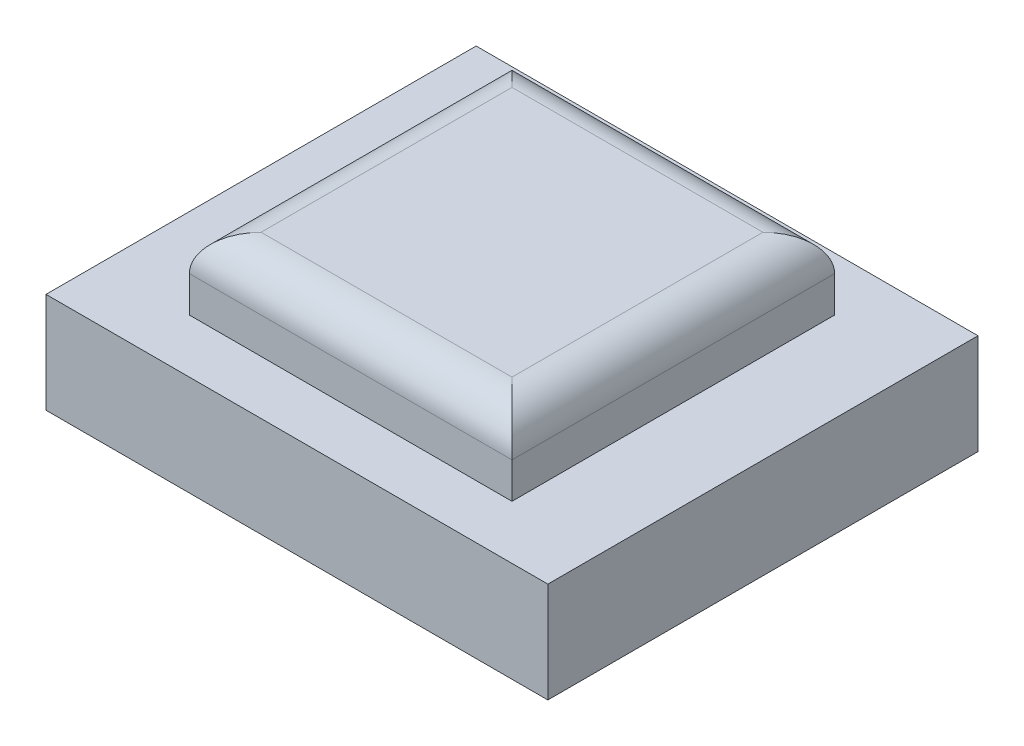
ISO-10303-21;
HEADER;
FILE_DESCRIPTION(('STEP AP214'),'2;1');
FILE_NAME('part.step','',(''),(''),'','','');
FILE_SCHEMA(('AUTOMOTIVE_DESIGN { 1 0 10303 214 1 1 1 1 }'));
ENDSEC;
DATA;
#1=APPLICATION_CONTEXT('core data for automotive mechanical design processes');
#2=APPLICATION_PROTOCOL_DEFINITION('international standard','automotive_design',2000,#1);
#3=PRODUCT_CONTEXT('',#1,'mechanical');
#4=PRODUCT('Part','Part','',(#3));
#5=PRODUCT_RELATED_PRODUCT_CATEGORY('part','',(#4));
#6=PRODUCT_DEFINITION_FORMATION('','',#4);
#7=PRODUCT_DEFINITION_CONTEXT('part definition',#1,'design');
#8=PRODUCT_DEFINITION('design','',#6,#7);
#9=PRODUCT_DEFINITION_SHAPE('','',#8);
#10=(LENGTH_UNIT() NAMED_UNIT(*) SI_UNIT(.MILLI.,.METRE.));
#11=(NAMED_UNIT(*) PLANE_ANGLE_UNIT() SI_UNIT($,.RADIAN.));
#12=(NAMED_UNIT(*) SI_UNIT($,.STERADIAN.) SOLID_ANGLE_UNIT());
#13=UNCERTAINTY_MEASURE_WITH_UNIT(LENGTH_MEASURE(1.E-05),#10,'distance_accuracy_value','');
#14=(GEOMETRIC_REPRESENTATION_CONTEXT(3) GLOBAL_UNCERTAINTY_ASSIGNED_CONTEXT((#13)) GLOBAL_UNIT_ASSIGNED_CONTEXT((#10,
#11,#12)) REPRESENTATION_CONTEXT('',''));
#15=CARTESIAN_POINT('',(0.,0.,0.));
#16=DIRECTION('',(0.,0.,1.));
#17=DIRECTION('',(1.,0.,0.));
#18=AXIS2_PLACEMENT_3D('',#15,#16,#17);
#19=CARTESIAN_POINT('',(1.75,0.7,-1.5));
#20=DIRECTION('',(-1.,0.,0.));
#21=DIRECTION('',(0.,0.,1.));
#22=AXIS2_PLACEMENT_3D('',#19,#20,#21);
#23=PLANE('',#22);
#24=DIRECTION('',(0.,0.,-1.));
#25=VECTOR('',#24,1.);
#26=CARTESIAN_POINT('',(1.75,0.,-1.5));
#27=LINE('',#26,#25);
#28=CARTESIAN_POINT('',(1.75,0.,1.5));
#29=VERTEX_POINT('',#28);
#30=CARTESIAN_POINT('',(1.75,0.,-1.5));
#31=VERTEX_POINT('',#30);
#32=EDGE_CURVE('E138',#29,#31,#27,.T.);
#33=ORIENTED_EDGE('',*,*,#32,.T.);
#34=DIRECTION('',(0.,-1.,0.));
#35=VECTOR('',#34,1.);
#36=CARTESIAN_POINT('',(1.75,0.7,-1.5));
#37=LINE('',#36,#35);
#38=CARTESIAN_POINT('',(1.75,0.7,-1.5));
#39=VERTEX_POINT('',#38);
#40=EDGE_CURVE('E168',#39,#31,#37,.T.);
#41=ORIENTED_EDGE('',*,*,#40,.F.);
#42=DIRECTION('',(0.,0.,-1.));
#43=VECTOR('',#42,1.);
#44=CARTESIAN_POINT('',(1.75,0.7,-1.5));
#45=LINE('',#44,#43);
#46=CARTESIAN_POINT('',(1.75,0.7,1.5));
#47=VERTEX_POINT('',#46);
#48=EDGE_CURVE('E142',#47,#39,#45,.T.);
#49=ORIENTED_EDGE('',*,*,#48,.F.);
#50=DIRECTION('',(0.,-1.,0.));
#51=VECTOR('',#50,1.);
#52=CARTESIAN_POINT('',(1.75,0.7,1.5));
#53=LINE('',#52,#51);
#54=EDGE_CURVE('E152',#47,#29,#53,.T.);
#55=ORIENTED_EDGE('',*,*,#54,.T.);
#56=EDGE_LOOP('',(#33,#41,#49,#55));
#57=FACE_BOUND('',#56,.T.);
#58=ADVANCED_FACE('F33',(#57),#23,.F.);
#59=CARTESIAN_POINT('',(-1.75,0.7,-1.5));
#60=DIRECTION('',(0.,0.,1.));
#61=DIRECTION('',(1.,0.,0.));
#62=AXIS2_PLACEMENT_3D('',#59,#60,#61);
#63=PLANE('',#62);
#64=DIRECTION('',(-1.,0.,0.));
#65=VECTOR('',#64,1.);
#66=CARTESIAN_POINT('',(-1.75,0.,-1.5));
#67=LINE('',#66,#65);
#68=CARTESIAN_POINT('',(-1.75,0.,-1.5));
#69=VERTEX_POINT('',#68);
#70=EDGE_CURVE('E155',#31,#69,#67,.T.);
#71=ORIENTED_EDGE('',*,*,#70,.T.);
#72=DIRECTION('',(0.,-1.,0.));
#73=VECTOR('',#72,1.);
#74=CARTESIAN_POINT('',(-1.75,0.7,-1.5));
#75=LINE('',#74,#73);
#76=CARTESIAN_POINT('',(-1.75,0.7,-1.5));
#77=VERTEX_POINT('',#76);
#78=EDGE_CURVE('E165',#77,#69,#75,.T.);
#79=ORIENTED_EDGE('',*,*,#78,.F.);
#80=DIRECTION('',(-1.,0.,0.));
#81=VECTOR('',#80,1.);
#82=CARTESIAN_POINT('',(-1.75,0.7,-1.5));
#83=LINE('',#82,#81);
#84=EDGE_CURVE('E145',#39,#77,#83,.T.);
#85=ORIENTED_EDGE('',*,*,#84,.F.);
#86=ORIENTED_EDGE('',*,*,#40,.T.);
#87=EDGE_LOOP('',(#71,#79,#85,#86));
#88=FACE_BOUND('',#87,.T.);
#89=ADVANCED_FACE('F220',(#88),#63,.F.);
#90=CARTESIAN_POINT('',(-1.75,0.7,-1.5));
#91=DIRECTION('',(1.,0.,0.));
#92=DIRECTION('',(0.,0.,-1.));
#93=AXIS2_PLACEMENT_3D('',#90,#91,#92);
#94=PLANE('',#93);
#95=DIRECTION('',(0.,0.,1.));
#96=VECTOR('',#95,1.);
#97=CARTESIAN_POINT('',(-1.75,0.,-1.5));
#98=LINE('',#97,#96);
#99=CARTESIAN_POINT('',(-1.75,0.,1.5));
#100=VERTEX_POINT('',#99);
#101=EDGE_CURVE('E157',#69,#100,#98,.T.);
#102=ORIENTED_EDGE('',*,*,#101,.T.);
#103=DIRECTION('',(0.,-1.,0.));
#104=VECTOR('',#103,1.);
#105=CARTESIAN_POINT('',(-1.75,0.7,1.5));
#106=LINE('',#105,#104);
#107=CARTESIAN_POINT('',(-1.75,0.7,1.5));
#108=VERTEX_POINT('',#107);
#109=EDGE_CURVE('E162',#108,#100,#106,.T.);
#110=ORIENTED_EDGE('',*,*,#109,.F.);
#111=DIRECTION('',(0.,0.,1.));
#112=VECTOR('',#111,1.);
#113=CARTESIAN_POINT('',(-1.75,0.7,-1.5));
#114=LINE('',#113,#112);
#115=EDGE_CURVE('E148',#77,#108,#114,.T.);
#116=ORIENTED_EDGE('',*,*,#115,.F.);
#117=ORIENTED_EDGE('',*,*,#78,.T.);
#118=EDGE_LOOP('',(#102,#110,#116,#117));
#119=FACE_BOUND('',#118,.T.);
#120=ADVANCED_FACE('F226',(#119),#94,.F.);
#121=CARTESIAN_POINT('',(-1.75,0.7,1.5));
#122=DIRECTION('',(0.,0.,-1.));
#123=DIRECTION('',(-1.,0.,0.));
#124=AXIS2_PLACEMENT_3D('',#121,#122,#123);
#125=PLANE('',#124);
#126=DIRECTION('',(1.,0.,0.));
#127=VECTOR('',#126,1.);
#128=CARTESIAN_POINT('',(-1.75,0.,1.5));
#129=LINE('',#128,#127);
#130=EDGE_CURVE('E146',#100,#29,#129,.T.);
#131=ORIENTED_EDGE('',*,*,#130,.T.);
#132=ORIENTED_EDGE('',*,*,#54,.F.);
#133=DIRECTION('',(1.,0.,0.));
#134=VECTOR('',#133,1.);
#135=CARTESIAN_POINT('',(-1.75,0.7,1.5));
#136=LINE('',#135,#134);
#137=EDGE_CURVE('E150',#108,#47,#136,.T.);
#138=ORIENTED_EDGE('',*,*,#137,.F.);
#139=ORIENTED_EDGE('',*,*,#109,.T.);
#140=EDGE_LOOP('',(#131,#132,#138,#139));
#141=FACE_BOUND('',#140,.T.);
#142=ADVANCED_FACE('F305',(#141),#125,.F.);
#143=CARTESIAN_POINT('',(0.,0.7,0.));
#144=DIRECTION('',(0.,1.,0.));
#145=DIRECTION('',(0.,0.,1.));
#146=AXIS2_PLACEMENT_3D('',#143,#144,#145);
#147=PLANE('',#146);
#148=DIRECTION('',(1.,0.,0.));
#149=VECTOR('',#148,1.);
#150=CARTESIAN_POINT('',(-1.125,0.7,-1.125));
#151=LINE('',#150,#149);
#152=CARTESIAN_POINT('',(-1.125,0.7,-1.125));
#153=VERTEX_POINT('',#152);
#154=CARTESIAN_POINT('',(1.125,0.7,-1.125));
#155=VERTEX_POINT('',#154);
#156=EDGE_CURVE('E112',#153,#155,#151,.T.);
#157=ORIENTED_EDGE('',*,*,#156,.T.);
#158=DIRECTION('',(0.,0.,1.));
#159=VECTOR('',#158,1.);
#160=CARTESIAN_POINT('',(1.125,0.7,-1.125));
#161=LINE('',#160,#159);
#162=CARTESIAN_POINT('',(1.125,0.7,1.125));
#163=VERTEX_POINT('',#162);
#164=EDGE_CURVE('E125',#155,#163,#161,.T.);
#165=ORIENTED_EDGE('',*,*,#164,.T.);
#166=DIRECTION('',(1.,0.,0.));
#167=VECTOR('',#166,1.);
#168=CARTESIAN_POINT('',(-1.125,0.7,1.125));
#169=LINE('',#168,#167);
#170=CARTESIAN_POINT('',(-1.125,0.7,1.125));
#171=VERTEX_POINT('',#170);
#172=EDGE_CURVE('E131',#171,#163,#169,.T.);
#173=ORIENTED_EDGE('',*,*,#172,.F.);
#174=DIRECTION('',(0.,0.,1.));
#175=VECTOR('',#174,1.);
#176=CARTESIAN_POINT('',(-1.125,0.7,-1.125));
#177=LINE('',#176,#175);
#178=EDGE_CURVE('E117',#153,#171,#177,.T.);
#179=ORIENTED_EDGE('',*,*,#178,.F.);
#180=EDGE_LOOP('',(#157,#165,#173,#179));
#181=FACE_BOUND('',#180,.T.);
#182=ORIENTED_EDGE('',*,*,#48,.T.);
#183=ORIENTED_EDGE('',*,*,#84,.T.);
#184=ORIENTED_EDGE('',*,*,#115,.T.);
#185=ORIENTED_EDGE('',*,*,#137,.T.);
#186=EDGE_LOOP('',(#182,#183,#184,#185));
#187=FACE_BOUND('',#186,.T.);
#188=ADVANCED_FACE('F122',(#181,#187),#147,.T.);
#189=CARTESIAN_POINT('',(0.,0.,0.));
#190=DIRECTION('',(0.,1.,0.));
#191=DIRECTION('',(0.,0.,1.));
#192=AXIS2_PLACEMENT_3D('',#189,#190,#191);
#193=PLANE('',#192);
#194=ORIENTED_EDGE('',*,*,#32,.F.);
#195=ORIENTED_EDGE('',*,*,#130,.F.);
#196=ORIENTED_EDGE('',*,*,#101,.F.);
#197=ORIENTED_EDGE('',*,*,#70,.F.);
#198=EDGE_LOOP('',(#194,#195,#196,#197));
#199=FACE_BOUND('',#198,.T.);
#200=ADVANCED_FACE('F288',(#199),#193,.F.);
#201=CARTESIAN_POINT('',(-1.125,1.2,-1.125));
#202=DIRECTION('',(0.,0.,-1.));
#203=DIRECTION('',(-1.,0.,0.));
#204=AXIS2_PLACEMENT_3D('',#201,#202,#203);
#205=PLANE('',#204);
#206=DIRECTION('',(0.,-1.,0.));
#207=VECTOR('',#206,1.);
#208=CARTESIAN_POINT('',(-1.125,1.2,-1.125));
#209=LINE('',#208,#207);
#210=CARTESIAN_POINT('',(-1.125,0.95,-1.125));
#211=VERTEX_POINT('',#210);
#212=EDGE_CURVE('E136',#211,#153,#209,.T.);
#213=ORIENTED_EDGE('',*,*,#212,.F.);
#214=DIRECTION('',(1.,0.,0.));
#215=VECTOR('',#214,1.);
#216=CARTESIAN_POINT('',(1.125,0.95,-1.125));
#217=LINE('',#216,#215);
#218=CARTESIAN_POINT('',(1.125,0.95,-1.125));
#219=VERTEX_POINT('',#218);
#220=EDGE_CURVE('E42',#211,#219,#217,.T.);
#221=ORIENTED_EDGE('',*,*,#220,.T.);
#222=DIRECTION('',(0.,-1.,0.));
#223=VECTOR('',#222,1.);
#224=CARTESIAN_POINT('',(1.125,1.2,-1.125));
#225=LINE('',#224,#223);
#226=EDGE_CURVE('E109',#219,#155,#225,.T.);
#227=ORIENTED_EDGE('',*,*,#226,.T.);
#228=ORIENTED_EDGE('',*,*,#156,.F.);
#229=EDGE_LOOP('',(#213,#221,#227,#228));
#230=FACE_BOUND('',#229,.T.);
#231=ADVANCED_FACE('F111',(#230),#205,.T.);
#232=CARTESIAN_POINT('',(-1.125,1.2,-1.125));
#233=DIRECTION('',(1.,0.,0.));
#234=DIRECTION('',(0.,0.,-1.));
#235=AXIS2_PLACEMENT_3D('',#232,#233,#234);
#236=PLANE('',#235);
#237=DIRECTION('',(0.,-1.,0.));
#238=VECTOR('',#237,1.);
#239=CARTESIAN_POINT('',(-1.125,1.2,1.125));
#240=LINE('',#239,#238);
#241=CARTESIAN_POINT('',(-1.125,0.95,1.125));
#242=VERTEX_POINT('',#241);
#243=EDGE_CURVE('E139',#242,#171,#240,.T.);
#244=ORIENTED_EDGE('',*,*,#243,.F.);
#245=DIRECTION('',(0.,0.,1.));
#246=VECTOR('',#245,1.);
#247=CARTESIAN_POINT('',(-1.125,0.95,-1.125));
#248=LINE('',#247,#246);
#249=EDGE_CURVE('E57',#242,#211,#248,.F.);
#250=ORIENTED_EDGE('',*,*,#249,.T.);
#251=ORIENTED_EDGE('',*,*,#212,.T.);
#252=ORIENTED_EDGE('',*,*,#178,.T.);
#253=EDGE_LOOP('',(#244,#250,#251,#252));
#254=FACE_BOUND('',#253,.T.);
#255=ADVANCED_FACE('F274',(#254),#236,.F.);
#256=CARTESIAN_POINT('',(-1.125,1.2,1.125));
#257=DIRECTION('',(0.,0.,-1.));
#258=DIRECTION('',(-1.,0.,0.));
#259=AXIS2_PLACEMENT_3D('',#256,#257,#258);
#260=PLANE('',#259);
#261=DIRECTION('',(0.,-1.,0.));
#262=VECTOR('',#261,1.);
#263=CARTESIAN_POINT('',(1.125,1.2,1.125));
#264=LINE('',#263,#262);
#265=CARTESIAN_POINT('',(1.125,0.95,1.125));
#266=VERTEX_POINT('',#265);
#267=EDGE_CURVE('E116',#266,#163,#264,.T.);
#268=ORIENTED_EDGE('',*,*,#267,.F.);
#269=DIRECTION('',(1.,0.,0.));
#270=VECTOR('',#269,1.);
#271=CARTESIAN_POINT('',(-1.125,0.95,1.125));
#272=LINE('',#271,#270);
#273=EDGE_CURVE('E180',#266,#242,#272,.F.);
#274=ORIENTED_EDGE('',*,*,#273,.T.);
#275=ORIENTED_EDGE('',*,*,#243,.T.);
#276=ORIENTED_EDGE('',*,*,#172,.T.);
#277=EDGE_LOOP('',(#268,#274,#275,#276));
#278=FACE_BOUND('',#277,.T.);
#279=ADVANCED_FACE('F205',(#278),#260,.F.);
#280=CARTESIAN_POINT('',(1.125,1.2,-1.125));
#281=DIRECTION('',(1.,0.,0.));
#282=DIRECTION('',(0.,0.,-1.));
#283=AXIS2_PLACEMENT_3D('',#280,#281,#282);
#284=PLANE('',#283);
#285=ORIENTED_EDGE('',*,*,#226,.F.);
#286=DIRECTION('',(0.,0.,1.));
#287=VECTOR('',#286,1.);
#288=CARTESIAN_POINT('',(1.125,0.95,1.125));
#289=LINE('',#288,#287);
#290=EDGE_CURVE('E11',#219,#266,#289,.T.);
#291=ORIENTED_EDGE('',*,*,#290,.T.);
#292=ORIENTED_EDGE('',*,*,#267,.T.);
#293=ORIENTED_EDGE('',*,*,#164,.F.);
#294=EDGE_LOOP('',(#285,#291,#292,#293));
#295=FACE_BOUND('',#294,.T.);
#296=ADVANCED_FACE('F129',(#295),#284,.T.);
#297=CARTESIAN_POINT('',(0.,1.2,0.));
#298=DIRECTION('',(0.,-1.,0.));
#299=DIRECTION('',(0.,0.,-1.));
#300=AXIS2_PLACEMENT_3D('',#297,#298,#299);
#301=PLANE('',#300);
#302=DIRECTION('',(0.,0.,1.));
#303=VECTOR('',#302,1.);
#304=CARTESIAN_POINT('',(-0.875,1.2,0.));
#305=LINE('',#304,#303);
#306=CARTESIAN_POINT('',(-0.875,1.2,-0.875));
#307=VERTEX_POINT('',#306);
#308=CARTESIAN_POINT('',(-0.875,1.2,0.875));
#309=VERTEX_POINT('',#308);
#310=EDGE_CURVE('E175',#307,#309,#305,.T.);
#311=ORIENTED_EDGE('',*,*,#310,.T.);
#312=DIRECTION('',(1.,0.,0.));
#313=VECTOR('',#312,1.);
#314=CARTESIAN_POINT('',(0.,1.2,0.875));
#315=LINE('',#314,#313);
#316=CARTESIAN_POINT('',(0.875,1.2,0.875));
#317=VERTEX_POINT('',#316);
#318=EDGE_CURVE('E177',#309,#317,#315,.T.);
#319=ORIENTED_EDGE('',*,*,#318,.T.);
#320=DIRECTION('',(0.,0.,1.));
#321=VECTOR('',#320,1.);
#322=CARTESIAN_POINT('',(0.874999999999999,1.2,-1.125));
#323=LINE('',#322,#321);
#324=CARTESIAN_POINT('',(0.874999999999999,1.2,-0.875));
#325=VERTEX_POINT('',#324);
#326=EDGE_CURVE('E171',#317,#325,#323,.F.);
#327=ORIENTED_EDGE('',*,*,#326,.T.);
#328=DIRECTION('',(1.,0.,0.));
#329=VECTOR('',#328,1.);
#330=CARTESIAN_POINT('',(-1.125,1.2,-0.875));
#331=LINE('',#330,#329);
#332=EDGE_CURVE('E173',#325,#307,#331,.F.);
#333=ORIENTED_EDGE('',*,*,#332,.T.);
#334=EDGE_LOOP('',(#311,#319,#327,#333));
#335=FACE_BOUND('',#334,.T.);
#336=ADVANCED_FACE('F210',(#335),#301,.F.);
#337=CARTESIAN_POINT('',(-1.125,0.95,-0.875));
#338=DIRECTION('',(-1.,0.,0.));
#339=DIRECTION('',(0.,0.,1.));
#340=AXIS2_PLACEMENT_3D('',#337,#338,#339);
#341=CYLINDRICAL_SURFACE('',#340,0.25);
#342=CARTESIAN_POINT('',(0.875,0.95,-0.875));
#343=DIRECTION('',(-0.707106781186548,0.,-0.707106781186547));
#344=DIRECTION('',(0.707106781186547,0.,-0.707106781186548));
#345=AXIS2_PLACEMENT_3D('',#342,#343,#344);
#346=ELLIPSE('',#345,0.353553390593274,0.25);
#347=EDGE_CURVE('E188',#219,#325,#346,.F.);
#348=ORIENTED_EDGE('',*,*,#347,.F.);
#349=ORIENTED_EDGE('',*,*,#220,.F.);
#350=CARTESIAN_POINT('',(-0.875,0.95,-0.875));
#351=DIRECTION('',(-0.707106781186547,0.,0.707106781186548));
#352=DIRECTION('',(-0.707106781186547,0.,-0.707106781186547));
#353=AXIS2_PLACEMENT_3D('',#350,#351,#352);
#354=ELLIPSE('',#353,0.353553390593274,0.25);
#355=EDGE_CURVE('E37',#307,#211,#354,.T.);
#356=ORIENTED_EDGE('',*,*,#355,.F.);
#357=ORIENTED_EDGE('',*,*,#332,.F.);
#358=EDGE_LOOP('',(#348,#349,#356,#357));
#359=FACE_BOUND('',#358,.T.);
#360=ADVANCED_FACE('F35',(#359),#341,.T.);
#361=CARTESIAN_POINT('',(-0.875,0.95,0.));
#362=DIRECTION('',(0.,0.,1.));
#363=DIRECTION('',(1.,0.,0.));
#364=AXIS2_PLACEMENT_3D('',#361,#362,#363);
#365=CYLINDRICAL_SURFACE('',#364,0.25);
#366=ORIENTED_EDGE('',*,*,#355,.T.);
#367=ORIENTED_EDGE('',*,*,#249,.F.);
#368=CARTESIAN_POINT('',(-0.875,0.95,0.875));
#369=DIRECTION('',(0.707106781186547,0.,0.707106781186547));
#370=DIRECTION('',(-0.707106781186547,0.,0.707106781186548));
#371=AXIS2_PLACEMENT_3D('',#368,#369,#370);
#372=ELLIPSE('',#371,0.353553390593274,0.25);
#373=EDGE_CURVE('E187',#309,#242,#372,.T.);
#374=ORIENTED_EDGE('',*,*,#373,.F.);
#375=ORIENTED_EDGE('',*,*,#310,.F.);
#376=EDGE_LOOP('',(#366,#367,#374,#375));
#377=FACE_BOUND('',#376,.T.);
#378=ADVANCED_FACE('F197',(#377),#365,.T.);
#379=CARTESIAN_POINT('',(0.874999999999999,0.95,-1.125));
#380=DIRECTION('',(0.,0.,-1.));
#381=DIRECTION('',(-1.,0.,0.));
#382=AXIS2_PLACEMENT_3D('',#379,#380,#381);
#383=CYLINDRICAL_SURFACE('',#382,0.25);
#384=ORIENTED_EDGE('',*,*,#347,.T.);
#385=ORIENTED_EDGE('',*,*,#326,.F.);
#386=CARTESIAN_POINT('',(0.875,0.95,0.875));
#387=DIRECTION('',(0.707106781186547,0.,-0.707106781186548));
#388=DIRECTION('',(-0.707106781186548,0.,-0.707106781186547));
#389=AXIS2_PLACEMENT_3D('',#386,#387,#388);
#390=ELLIPSE('',#389,0.353553390593274,0.25);
#391=EDGE_CURVE('E185',#266,#317,#390,.F.);
#392=ORIENTED_EDGE('',*,*,#391,.F.);
#393=ORIENTED_EDGE('',*,*,#290,.F.);
#394=EDGE_LOOP('',(#384,#385,#392,#393));
#395=FACE_BOUND('',#394,.T.);
#396=ADVANCED_FACE('F202',(#395),#383,.T.);
#397=CARTESIAN_POINT('',(0.,0.95,0.875));
#398=DIRECTION('',(1.,0.,0.));
#399=DIRECTION('',(0.,0.,-1.));
#400=AXIS2_PLACEMENT_3D('',#397,#398,#399);
#401=CYLINDRICAL_SURFACE('',#400,0.25);
#402=ORIENTED_EDGE('',*,*,#373,.T.);
#403=ORIENTED_EDGE('',*,*,#273,.F.);
#404=ORIENTED_EDGE('',*,*,#391,.T.);
#405=ORIENTED_EDGE('',*,*,#318,.F.);
#406=EDGE_LOOP('',(#402,#403,#404,#405));
#407=FACE_BOUND('',#406,.T.);
#408=ADVANCED_FACE('F207',(#407),#401,.T.);
#409=CLOSED_SHELL('',(#58,#89,#120,#142,#188,#200,#231,#255,#279,#296,#336,#360,#378,#396,#408));
#410=MANIFOLD_SOLID_BREP('B2',#409);
#411=ADVANCED_BREP_SHAPE_REPRESENTATION('',(#18,#410),#14);
#412=SHAPE_DEFINITION_REPRESENTATION(#9,#411);
ENDSEC;
END-ISO-10303-21;
